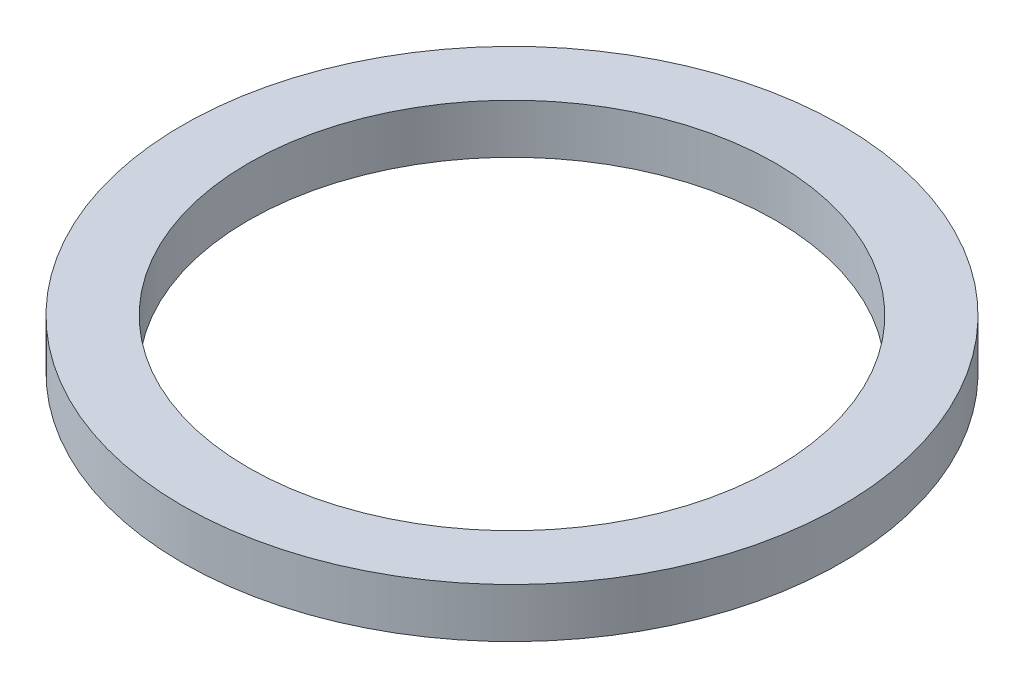
ISO-10303-21;
HEADER;
FILE_DESCRIPTION(('STEP AP214'),'2;1');
FILE_NAME('part.step','',(''),(''),'','','');
FILE_SCHEMA(('AUTOMOTIVE_DESIGN { 1 0 10303 214 1 1 1 1 }'));
ENDSEC;
DATA;
#1=APPLICATION_CONTEXT('core data for automotive mechanical design processes');
#2=APPLICATION_PROTOCOL_DEFINITION('international standard','automotive_design',2000,#1);
#3=PRODUCT_CONTEXT('',#1,'mechanical');
#4=PRODUCT('Part','Part','',(#3));
#5=PRODUCT_RELATED_PRODUCT_CATEGORY('part','',(#4));
#6=PRODUCT_DEFINITION_FORMATION('','',#4);
#7=PRODUCT_DEFINITION_CONTEXT('part definition',#1,'design');
#8=PRODUCT_DEFINITION('design','',#6,#7);
#9=PRODUCT_DEFINITION_SHAPE('','',#8);
#10=(LENGTH_UNIT() NAMED_UNIT(*) SI_UNIT(.MILLI.,.METRE.));
#11=(NAMED_UNIT(*) PLANE_ANGLE_UNIT() SI_UNIT($,.RADIAN.));
#12=(NAMED_UNIT(*) SI_UNIT($,.STERADIAN.) SOLID_ANGLE_UNIT());
#13=UNCERTAINTY_MEASURE_WITH_UNIT(LENGTH_MEASURE(1.E-05),#10,'distance_accuracy_value','');
#14=(GEOMETRIC_REPRESENTATION_CONTEXT(3) GLOBAL_UNCERTAINTY_ASSIGNED_CONTEXT((#13)) GLOBAL_UNIT_ASSIGNED_CONTEXT((#10,
#11,#12)) REPRESENTATION_CONTEXT('',''));
#15=CARTESIAN_POINT('',(0.,0.,0.));
#16=DIRECTION('',(0.,0.,1.));
#17=DIRECTION('',(1.,0.,0.));
#18=AXIS2_PLACEMENT_3D('',#15,#16,#17);
#19=CARTESIAN_POINT('',(0.,0.,0.));
#20=DIRECTION('',(0.,-1.,0.));
#21=DIRECTION('',(0.,0.,-1.));
#22=AXIS2_PLACEMENT_3D('',#19,#20,#21);
#23=CYLINDRICAL_SURFACE('',#22,10.);
#24=CARTESIAN_POINT('',(0.,-0.75,0.));
#25=DIRECTION('',(0.,-1.,0.));
#26=DIRECTION('',(0.,0.,-1.));
#27=AXIS2_PLACEMENT_3D('',#24,#25,#26);
#28=CIRCLE('',#27,10.);
#29=CARTESIAN_POINT('',(0.,-0.75,-10.));
#30=VERTEX_POINT('',#29);
#31=EDGE_CURVE('E10',#30,#30,#28,.T.);
#32=ORIENTED_EDGE('',*,*,#31,.F.);
#33=EDGE_LOOP('',(#32));
#34=FACE_BOUND('',#33,.T.);
#35=CARTESIAN_POINT('',(0.,0.75,0.));
#36=DIRECTION('',(0.,-1.,0.));
#37=DIRECTION('',(0.,0.,-1.));
#38=AXIS2_PLACEMENT_3D('',#35,#36,#37);
#39=CIRCLE('',#38,10.);
#40=CARTESIAN_POINT('',(0.,0.75,-10.));
#41=VERTEX_POINT('',#40);
#42=EDGE_CURVE('E46',#41,#41,#39,.T.);
#43=ORIENTED_EDGE('',*,*,#42,.T.);
#44=EDGE_LOOP('',(#43));
#45=FACE_BOUND('',#44,.T.);
#46=ADVANCED_FACE('F32',(#34,#45),#23,.T.);
#47=CARTESIAN_POINT('',(-10.,-0.75,0.));
#48=DIRECTION('',(0.,1.,0.));
#49=DIRECTION('',(0.,0.,1.));
#50=AXIS2_PLACEMENT_3D('',#47,#48,#49);
#51=PLANE('',#50);
#52=CARTESIAN_POINT('',(0.,-0.75,0.));
#53=DIRECTION('',(0.,-1.,0.));
#54=DIRECTION('',(0.,0.,-1.));
#55=AXIS2_PLACEMENT_3D('',#52,#53,#54);
#56=CIRCLE('',#55,8.);
#57=CARTESIAN_POINT('',(0.,-0.75,-8.));
#58=VERTEX_POINT('',#57);
#59=EDGE_CURVE('E38',#58,#58,#56,.T.);
#60=ORIENTED_EDGE('',*,*,#59,.F.);
#61=EDGE_LOOP('',(#60));
#62=FACE_BOUND('',#61,.T.);
#63=ORIENTED_EDGE('',*,*,#31,.T.);
#64=EDGE_LOOP('',(#63));
#65=FACE_BOUND('',#64,.T.);
#66=ADVANCED_FACE('F61',(#62,#65),#51,.F.);
#67=CARTESIAN_POINT('',(0.,0.,0.));
#68=DIRECTION('',(0.,-1.,0.));
#69=DIRECTION('',(0.,0.,-1.));
#70=AXIS2_PLACEMENT_3D('',#67,#68,#69);
#71=CYLINDRICAL_SURFACE('',#70,8.);
#72=CARTESIAN_POINT('',(0.,0.75,0.));
#73=DIRECTION('',(0.,-1.,0.));
#74=DIRECTION('',(0.,0.,-1.));
#75=AXIS2_PLACEMENT_3D('',#72,#73,#74);
#76=CIRCLE('',#75,8.);
#77=CARTESIAN_POINT('',(0.,0.75,-8.));
#78=VERTEX_POINT('',#77);
#79=EDGE_CURVE('E42',#78,#78,#76,.T.);
#80=ORIENTED_EDGE('',*,*,#79,.F.);
#81=EDGE_LOOP('',(#80));
#82=FACE_BOUND('',#81,.T.);
#83=ORIENTED_EDGE('',*,*,#59,.T.);
#84=EDGE_LOOP('',(#83));
#85=FACE_BOUND('',#84,.T.);
#86=ADVANCED_FACE('F56',(#82,#85),#71,.F.);
#87=CARTESIAN_POINT('',(-10.,0.75,0.));
#88=DIRECTION('',(0.,-1.,0.));
#89=DIRECTION('',(0.,0.,-1.));
#90=AXIS2_PLACEMENT_3D('',#87,#88,#89);
#91=PLANE('',#90);
#92=ORIENTED_EDGE('',*,*,#42,.F.);
#93=EDGE_LOOP('',(#92));
#94=FACE_BOUND('',#93,.T.);
#95=ORIENTED_EDGE('',*,*,#79,.T.);
#96=EDGE_LOOP('',(#95));
#97=FACE_BOUND('',#96,.T.);
#98=ADVANCED_FACE('F53',(#94,#97),#91,.F.);
#99=CLOSED_SHELL('',(#46,#66,#86,#98));
#100=MANIFOLD_SOLID_BREP('B2',#99);
#101=ADVANCED_BREP_SHAPE_REPRESENTATION('',(#18,#100),#14);
#102=SHAPE_DEFINITION_REPRESENTATION(#9,#101);
ENDSEC;
END-ISO-10303-21;
